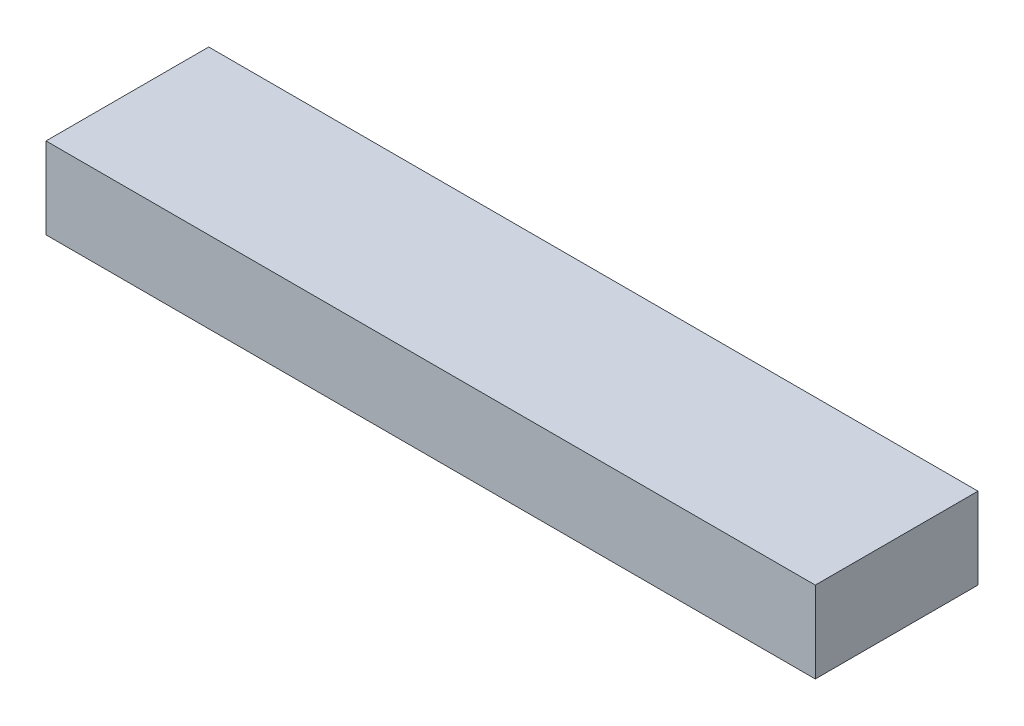
ISO-10303-21;
HEADER;
FILE_DESCRIPTION(('STEP AP214'),'2;1');
FILE_NAME('part.step','',(''),(''),'','','');
FILE_SCHEMA(('AUTOMOTIVE_DESIGN { 1 0 10303 214 1 1 1 1 }'));
ENDSEC;
DATA;
#1=APPLICATION_CONTEXT('core data for automotive mechanical design processes');
#2=APPLICATION_PROTOCOL_DEFINITION('international standard','automotive_design',2000,#1);
#3=PRODUCT_CONTEXT('',#1,'mechanical');
#4=PRODUCT('Part','Part','',(#3));
#5=PRODUCT_RELATED_PRODUCT_CATEGORY('part','',(#4));
#6=PRODUCT_DEFINITION_FORMATION('','',#4);
#7=PRODUCT_DEFINITION_CONTEXT('part definition',#1,'design');
#8=PRODUCT_DEFINITION('design','',#6,#7);
#9=PRODUCT_DEFINITION_SHAPE('','',#8);
#10=(LENGTH_UNIT() NAMED_UNIT(*) SI_UNIT(.MILLI.,.METRE.));
#11=(NAMED_UNIT(*) PLANE_ANGLE_UNIT() SI_UNIT($,.RADIAN.));
#12=(NAMED_UNIT(*) SI_UNIT($,.STERADIAN.) SOLID_ANGLE_UNIT());
#13=UNCERTAINTY_MEASURE_WITH_UNIT(LENGTH_MEASURE(1.E-05),#10,'distance_accuracy_value','');
#14=(GEOMETRIC_REPRESENTATION_CONTEXT(3) GLOBAL_UNCERTAINTY_ASSIGNED_CONTEXT((#13)) GLOBAL_UNIT_ASSIGNED_CONTEXT((#10,
#11,#12)) REPRESENTATION_CONTEXT('',''));
#15=CARTESIAN_POINT('',(0.,0.,0.));
#16=DIRECTION('',(0.,0.,1.));
#17=DIRECTION('',(1.,0.,0.));
#18=AXIS2_PLACEMENT_3D('',#15,#16,#17);
#19=CARTESIAN_POINT('',(0.,5.,10.));
#20=DIRECTION('',(1.,0.,0.));
#21=DIRECTION('',(0.,0.,-1.));
#22=AXIS2_PLACEMENT_3D('',#19,#20,#21);
#23=PLANE('',#22);
#24=DIRECTION('',(0.,0.,1.));
#25=VECTOR('',#24,1.);
#26=CARTESIAN_POINT('',(0.,0.,10.));
#27=LINE('',#26,#25);
#28=CARTESIAN_POINT('',(0.,0.,0.));
#29=VERTEX_POINT('',#28);
#30=CARTESIAN_POINT('',(0.,0.,10.));
#31=VERTEX_POINT('',#30);
#32=EDGE_CURVE('E98',#29,#31,#27,.T.);
#33=ORIENTED_EDGE('',*,*,#32,.T.);
#34=DIRECTION('',(0.,-1.,0.));
#35=VECTOR('',#34,1.);
#36=CARTESIAN_POINT('',(0.,5.,10.));
#37=LINE('',#36,#35);
#38=CARTESIAN_POINT('',(0.,5.,10.));
#39=VERTEX_POINT('',#38);
#40=EDGE_CURVE('E11',#39,#31,#37,.T.);
#41=ORIENTED_EDGE('',*,*,#40,.F.);
#42=DIRECTION('',(0.,0.,1.));
#43=VECTOR('',#42,1.);
#44=CARTESIAN_POINT('',(0.,5.,10.));
#45=LINE('',#44,#43);
#46=CARTESIAN_POINT('',(0.,5.,0.));
#47=VERTEX_POINT('',#46);
#48=EDGE_CURVE('E86',#47,#39,#45,.T.);
#49=ORIENTED_EDGE('',*,*,#48,.F.);
#50=DIRECTION('',(0.,-1.,0.));
#51=VECTOR('',#50,1.);
#52=CARTESIAN_POINT('',(0.,5.,0.));
#53=LINE('',#52,#51);
#54=EDGE_CURVE('E94',#47,#29,#53,.T.);
#55=ORIENTED_EDGE('',*,*,#54,.T.);
#56=EDGE_LOOP('',(#33,#41,#49,#55));
#57=FACE_BOUND('',#56,.T.);
#58=ADVANCED_FACE('F35',(#57),#23,.F.);
#59=CARTESIAN_POINT('',(47.28,5.,10.));
#60=DIRECTION('',(0.,0.,-1.));
#61=DIRECTION('',(-1.,0.,0.));
#62=AXIS2_PLACEMENT_3D('',#59,#60,#61);
#63=PLANE('',#62);
#64=DIRECTION('',(1.,0.,0.));
#65=VECTOR('',#64,1.);
#66=CARTESIAN_POINT('',(47.28,0.,10.));
#67=LINE('',#66,#65);
#68=CARTESIAN_POINT('',(47.28,0.,10.));
#69=VERTEX_POINT('',#68);
#70=EDGE_CURVE('E90',#31,#69,#67,.T.);
#71=ORIENTED_EDGE('',*,*,#70,.T.);
#72=DIRECTION('',(0.,-1.,0.));
#73=VECTOR('',#72,1.);
#74=CARTESIAN_POINT('',(47.28,5.,10.));
#75=LINE('',#74,#73);
#76=CARTESIAN_POINT('',(47.28,5.,10.));
#77=VERTEX_POINT('',#76);
#78=EDGE_CURVE('E43',#77,#69,#75,.T.);
#79=ORIENTED_EDGE('',*,*,#78,.F.);
#80=DIRECTION('',(1.,0.,0.));
#81=VECTOR('',#80,1.);
#82=CARTESIAN_POINT('',(47.28,5.,10.));
#83=LINE('',#82,#81);
#84=EDGE_CURVE('E81',#39,#77,#83,.T.);
#85=ORIENTED_EDGE('',*,*,#84,.F.);
#86=ORIENTED_EDGE('',*,*,#40,.T.);
#87=EDGE_LOOP('',(#71,#79,#85,#86));
#88=FACE_BOUND('',#87,.T.);
#89=ADVANCED_FACE('F89',(#88),#63,.F.);
#90=CARTESIAN_POINT('',(47.28,5.,0.));
#91=DIRECTION('',(-1.,0.,0.));
#92=DIRECTION('',(0.,0.,1.));
#93=AXIS2_PLACEMENT_3D('',#90,#91,#92);
#94=PLANE('',#93);
#95=DIRECTION('',(0.,0.,-1.));
#96=VECTOR('',#95,1.);
#97=CARTESIAN_POINT('',(47.28,0.,0.));
#98=LINE('',#97,#96);
#99=CARTESIAN_POINT('',(47.28,0.,0.));
#100=VERTEX_POINT('',#99);
#101=EDGE_CURVE('E68',#69,#100,#98,.T.);
#102=ORIENTED_EDGE('',*,*,#101,.T.);
#103=DIRECTION('',(0.,-1.,0.));
#104=VECTOR('',#103,1.);
#105=CARTESIAN_POINT('',(47.28,5.,0.));
#106=LINE('',#105,#104);
#107=CARTESIAN_POINT('',(47.28,5.,0.));
#108=VERTEX_POINT('',#107);
#109=EDGE_CURVE('E91',#108,#100,#106,.T.);
#110=ORIENTED_EDGE('',*,*,#109,.F.);
#111=DIRECTION('',(0.,0.,-1.));
#112=VECTOR('',#111,1.);
#113=CARTESIAN_POINT('',(47.28,5.,0.));
#114=LINE('',#113,#112);
#115=EDGE_CURVE('E84',#77,#108,#114,.T.);
#116=ORIENTED_EDGE('',*,*,#115,.F.);
#117=ORIENTED_EDGE('',*,*,#78,.T.);
#118=EDGE_LOOP('',(#102,#110,#116,#117));
#119=FACE_BOUND('',#118,.T.);
#120=ADVANCED_FACE('F92',(#119),#94,.F.);
#121=CARTESIAN_POINT('',(0.,5.,0.));
#122=DIRECTION('',(0.,0.,1.));
#123=DIRECTION('',(1.,0.,0.));
#124=AXIS2_PLACEMENT_3D('',#121,#122,#123);
#125=PLANE('',#124);
#126=DIRECTION('',(-1.,0.,0.));
#127=VECTOR('',#126,1.);
#128=CARTESIAN_POINT('',(0.,0.,0.));
#129=LINE('',#128,#127);
#130=EDGE_CURVE('E74',#100,#29,#129,.T.);
#131=ORIENTED_EDGE('',*,*,#130,.T.);
#132=ORIENTED_EDGE('',*,*,#54,.F.);
#133=DIRECTION('',(-1.,0.,0.));
#134=VECTOR('',#133,1.);
#135=CARTESIAN_POINT('',(0.,5.,0.));
#136=LINE('',#135,#134);
#137=EDGE_CURVE('E51',#108,#47,#136,.T.);
#138=ORIENTED_EDGE('',*,*,#137,.F.);
#139=ORIENTED_EDGE('',*,*,#109,.T.);
#140=EDGE_LOOP('',(#131,#132,#138,#139));
#141=FACE_BOUND('',#140,.T.);
#142=ADVANCED_FACE('F105',(#141),#125,.F.);
#143=CARTESIAN_POINT('',(0.,5.,0.));
#144=DIRECTION('',(0.,-1.,0.));
#145=DIRECTION('',(0.,0.,-1.));
#146=AXIS2_PLACEMENT_3D('',#143,#144,#145);
#147=PLANE('',#146);
#148=ORIENTED_EDGE('',*,*,#48,.T.);
#149=ORIENTED_EDGE('',*,*,#84,.T.);
#150=ORIENTED_EDGE('',*,*,#115,.T.);
#151=ORIENTED_EDGE('',*,*,#137,.T.);
#152=EDGE_LOOP('',(#148,#149,#150,#151));
#153=FACE_BOUND('',#152,.T.);
#154=ADVANCED_FACE('F82',(#153),#147,.F.);
#155=CARTESIAN_POINT('',(0.,0.,0.));
#156=DIRECTION('',(0.,-1.,0.));
#157=DIRECTION('',(0.,0.,-1.));
#158=AXIS2_PLACEMENT_3D('',#155,#156,#157);
#159=PLANE('',#158);
#160=ORIENTED_EDGE('',*,*,#32,.F.);
#161=ORIENTED_EDGE('',*,*,#130,.F.);
#162=ORIENTED_EDGE('',*,*,#101,.F.);
#163=ORIENTED_EDGE('',*,*,#70,.F.);
#164=EDGE_LOOP('',(#160,#161,#162,#163));
#165=FACE_BOUND('',#164,.T.);
#166=ADVANCED_FACE('F108',(#165),#159,.T.);
#167=CLOSED_SHELL('',(#58,#89,#120,#142,#154,#166));
#168=MANIFOLD_SOLID_BREP('B2',#167);
#169=ADVANCED_BREP_SHAPE_REPRESENTATION('',(#18,#168),#14);
#170=SHAPE_DEFINITION_REPRESENTATION(#9,#169);
ENDSEC;
END-ISO-10303-21;
